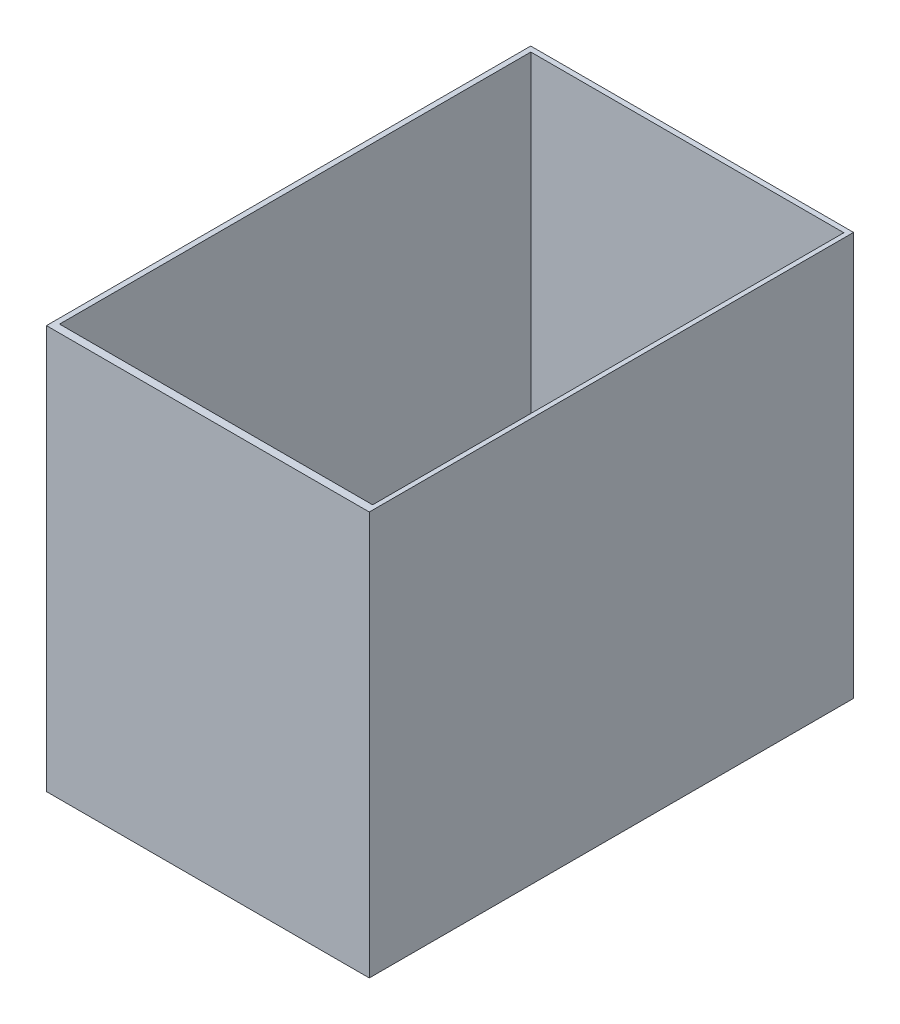
ISO-10303-21;
HEADER;
FILE_DESCRIPTION(('STEP AP214'),'2;1');
FILE_NAME('part.step','',(''),(''),'','','');
FILE_SCHEMA(('AUTOMOTIVE_DESIGN { 1 0 10303 214 1 1 1 1 }'));
ENDSEC;
DATA;
#1=APPLICATION_CONTEXT('core data for automotive mechanical design processes');
#2=APPLICATION_PROTOCOL_DEFINITION('international standard','automotive_design',2000,#1);
#3=PRODUCT_CONTEXT('',#1,'mechanical');
#4=PRODUCT('Part','Part','',(#3));
#5=PRODUCT_RELATED_PRODUCT_CATEGORY('part','',(#4));
#6=PRODUCT_DEFINITION_FORMATION('','',#4);
#7=PRODUCT_DEFINITION_CONTEXT('part definition',#1,'design');
#8=PRODUCT_DEFINITION('design','',#6,#7);
#9=PRODUCT_DEFINITION_SHAPE('','',#8);
#10=(LENGTH_UNIT() NAMED_UNIT(*) SI_UNIT(.MILLI.,.METRE.));
#11=(NAMED_UNIT(*) PLANE_ANGLE_UNIT() SI_UNIT($,.RADIAN.));
#12=(NAMED_UNIT(*) SI_UNIT($,.STERADIAN.) SOLID_ANGLE_UNIT());
#13=UNCERTAINTY_MEASURE_WITH_UNIT(LENGTH_MEASURE(1.E-05),#10,'distance_accuracy_value','');
#14=(GEOMETRIC_REPRESENTATION_CONTEXT(3) GLOBAL_UNCERTAINTY_ASSIGNED_CONTEXT((#13)) GLOBAL_UNIT_ASSIGNED_CONTEXT((#10,
#11,#12)) REPRESENTATION_CONTEXT('',''));
#15=CARTESIAN_POINT('',(0.,0.,0.));
#16=DIRECTION('',(0.,0.,1.));
#17=DIRECTION('',(1.,0.,0.));
#18=AXIS2_PLACEMENT_3D('',#15,#16,#17);
#19=CARTESIAN_POINT('',(-342.204724409449,1000.,-193.055118110236));
#20=DIRECTION('',(1.,0.,0.));
#21=DIRECTION('',(0.,0.,-1.));
#22=AXIS2_PLACEMENT_3D('',#19,#20,#21);
#23=PLANE('',#22);
#24=DIRECTION('',(0.,0.,1.));
#25=VECTOR('',#24,1.);
#26=CARTESIAN_POINT('',(-342.204724409449,0.,-193.055118110236));
#27=LINE('',#26,#25);
#28=CARTESIAN_POINT('',(-342.204724409449,0.,-193.055118110236));
#29=VERTEX_POINT('',#28);
#30=CARTESIAN_POINT('',(-342.204724409449,0.,1006.94488188976));
#31=VERTEX_POINT('',#30);
#32=EDGE_CURVE('E140',#29,#31,#27,.T.);
#33=ORIENTED_EDGE('',*,*,#32,.T.);
#34=DIRECTION('',(0.,-1.,0.));
#35=VECTOR('',#34,1.);
#36=CARTESIAN_POINT('',(-342.204724409449,1000.,1006.94488188976));
#37=LINE('',#36,#35);
#38=CARTESIAN_POINT('',(-342.204724409449,1000.,1006.94488188976));
#39=VERTEX_POINT('',#38);
#40=EDGE_CURVE('E11',#39,#31,#37,.T.);
#41=ORIENTED_EDGE('',*,*,#40,.F.);
#42=DIRECTION('',(0.,0.,1.));
#43=VECTOR('',#42,1.);
#44=CARTESIAN_POINT('',(-342.204724409449,1000.,-193.055118110236));
#45=LINE('',#44,#43);
#46=CARTESIAN_POINT('',(-342.204724409449,1000.,-193.055118110236));
#47=VERTEX_POINT('',#46);
#48=EDGE_CURVE('E144',#47,#39,#45,.T.);
#49=ORIENTED_EDGE('',*,*,#48,.F.);
#50=DIRECTION('',(0.,-1.,0.));
#51=VECTOR('',#50,1.);
#52=CARTESIAN_POINT('',(-342.204724409449,1000.,-193.055118110236));
#53=LINE('',#52,#51);
#54=EDGE_CURVE('E150',#47,#29,#53,.T.);
#55=ORIENTED_EDGE('',*,*,#54,.T.);
#56=EDGE_LOOP('',(#33,#41,#49,#55));
#57=FACE_BOUND('',#56,.T.);
#58=ADVANCED_FACE('F32',(#57),#23,.F.);
#59=CARTESIAN_POINT('',(-342.204724409449,1000.,1006.94488188976));
#60=DIRECTION('',(0.,0.,-1.));
#61=DIRECTION('',(-1.,0.,0.));
#62=AXIS2_PLACEMENT_3D('',#59,#60,#61);
#63=PLANE('',#62);
#64=DIRECTION('',(1.,0.,0.));
#65=VECTOR('',#64,1.);
#66=CARTESIAN_POINT('',(-342.204724409449,0.,1006.94488188976));
#67=LINE('',#66,#65);
#68=CARTESIAN_POINT('',(457.795275590551,0.,1006.94488188976));
#69=VERTEX_POINT('',#68);
#70=EDGE_CURVE('E153',#31,#69,#67,.T.);
#71=ORIENTED_EDGE('',*,*,#70,.T.);
#72=DIRECTION('',(0.,-1.,0.));
#73=VECTOR('',#72,1.);
#74=CARTESIAN_POINT('',(457.795275590551,1000.,1006.94488188976));
#75=LINE('',#74,#73);
#76=CARTESIAN_POINT('',(457.795275590551,1000.,1006.94488188976));
#77=VERTEX_POINT('',#76);
#78=EDGE_CURVE('E39',#77,#69,#75,.T.);
#79=ORIENTED_EDGE('',*,*,#78,.F.);
#80=DIRECTION('',(1.,0.,0.));
#81=VECTOR('',#80,1.);
#82=CARTESIAN_POINT('',(-342.204724409449,1000.,1006.94488188976));
#83=LINE('',#82,#81);
#84=EDGE_CURVE('E83',#39,#77,#83,.T.);
#85=ORIENTED_EDGE('',*,*,#84,.F.);
#86=ORIENTED_EDGE('',*,*,#40,.T.);
#87=EDGE_LOOP('',(#71,#79,#85,#86));
#88=FACE_BOUND('',#87,.T.);
#89=ADVANCED_FACE('F182',(#88),#63,.F.);
#90=CARTESIAN_POINT('',(457.795275590551,1000.,-193.055118110236));
#91=DIRECTION('',(-1.,0.,0.));
#92=DIRECTION('',(0.,0.,1.));
#93=AXIS2_PLACEMENT_3D('',#90,#91,#92);
#94=PLANE('',#93);
#95=DIRECTION('',(0.,0.,-1.));
#96=VECTOR('',#95,1.);
#97=CARTESIAN_POINT('',(457.795275590551,0.,-193.055118110236));
#98=LINE('',#97,#96);
#99=CARTESIAN_POINT('',(457.795275590551,0.,-193.055118110236));
#100=VERTEX_POINT('',#99);
#101=EDGE_CURVE('E155',#69,#100,#98,.T.);
#102=ORIENTED_EDGE('',*,*,#101,.T.);
#103=DIRECTION('',(0.,-1.,0.));
#104=VECTOR('',#103,1.);
#105=CARTESIAN_POINT('',(457.795275590551,1000.,-193.055118110236));
#106=LINE('',#105,#104);
#107=CARTESIAN_POINT('',(457.795275590551,1000.,-193.055118110236));
#108=VERTEX_POINT('',#107);
#109=EDGE_CURVE('E159',#108,#100,#106,.T.);
#110=ORIENTED_EDGE('',*,*,#109,.F.);
#111=DIRECTION('',(0.,0.,-1.));
#112=VECTOR('',#111,1.);
#113=CARTESIAN_POINT('',(457.795275590551,1000.,-193.055118110236));
#114=LINE('',#113,#112);
#115=EDGE_CURVE('E147',#77,#108,#114,.T.);
#116=ORIENTED_EDGE('',*,*,#115,.F.);
#117=ORIENTED_EDGE('',*,*,#78,.T.);
#118=EDGE_LOOP('',(#102,#110,#116,#117));
#119=FACE_BOUND('',#118,.T.);
#120=ADVANCED_FACE('F164',(#119),#94,.F.);
#121=CARTESIAN_POINT('',(-342.204724409449,1000.,-193.055118110236));
#122=DIRECTION('',(0.,0.,1.));
#123=DIRECTION('',(1.,0.,0.));
#124=AXIS2_PLACEMENT_3D('',#121,#122,#123);
#125=PLANE('',#124);
#126=DIRECTION('',(-1.,0.,0.));
#127=VECTOR('',#126,1.);
#128=CARTESIAN_POINT('',(-342.204724409449,0.,-193.055118110236));
#129=LINE('',#128,#127);
#130=EDGE_CURVE('E76',#100,#29,#129,.T.);
#131=ORIENTED_EDGE('',*,*,#130,.T.);
#132=ORIENTED_EDGE('',*,*,#54,.F.);
#133=DIRECTION('',(-1.,0.,0.));
#134=VECTOR('',#133,1.);
#135=CARTESIAN_POINT('',(-342.204724409449,1000.,-193.055118110236));
#136=LINE('',#135,#134);
#137=EDGE_CURVE('E55',#108,#47,#136,.T.);
#138=ORIENTED_EDGE('',*,*,#137,.F.);
#139=ORIENTED_EDGE('',*,*,#109,.T.);
#140=EDGE_LOOP('',(#131,#132,#138,#139));
#141=FACE_BOUND('',#140,.T.);
#142=ADVANCED_FACE('F172',(#141),#125,.F.);
#143=CARTESIAN_POINT('',(0.,1000.,0.));
#144=DIRECTION('',(0.,1.,0.));
#145=DIRECTION('',(0.,0.,1.));
#146=AXIS2_PLACEMENT_3D('',#143,#144,#145);
#147=PLANE('',#146);
#148=DIRECTION('',(0.,0.,1.));
#149=VECTOR('',#148,1.);
#150=CARTESIAN_POINT('',(-329.188594997637,1000.,-180.26833564313));
#151=LINE('',#150,#149);
#152=CARTESIAN_POINT('',(-329.188594997637,1000.,-180.26833564313));
#153=VERTEX_POINT('',#152);
#154=CARTESIAN_POINT('',(-329.188594997637,1000.,987.456664700449));
#155=VERTEX_POINT('',#154);
#156=EDGE_CURVE('E46',#153,#155,#151,.T.);
#157=ORIENTED_EDGE('',*,*,#156,.F.);
#158=DIRECTION('',(-1.,0.,0.));
#159=VECTOR('',#158,1.);
#160=CARTESIAN_POINT('',(-329.188594997637,1000.,-180.26833564313));
#161=LINE('',#160,#159);
#162=CARTESIAN_POINT('',(446.502474097165,1000.,-180.26833564313));
#163=VERTEX_POINT('',#162);
#164=EDGE_CURVE('E125',#163,#153,#161,.T.);
#165=ORIENTED_EDGE('',*,*,#164,.F.);
#166=DIRECTION('',(0.,0.,-1.));
#167=VECTOR('',#166,1.);
#168=CARTESIAN_POINT('',(446.502474097165,1000.,-180.26833564313));
#169=LINE('',#168,#167);
#170=CARTESIAN_POINT('',(446.502474097165,1000.,987.456664700449));
#171=VERTEX_POINT('',#170);
#172=EDGE_CURVE('E128',#171,#163,#169,.T.);
#173=ORIENTED_EDGE('',*,*,#172,.F.);
#174=DIRECTION('',(1.,0.,0.));
#175=VECTOR('',#174,1.);
#176=CARTESIAN_POINT('',(-329.188594997637,1000.,987.456664700449));
#177=LINE('',#176,#175);
#178=EDGE_CURVE('E134',#155,#171,#177,.T.);
#179=ORIENTED_EDGE('',*,*,#178,.F.);
#180=EDGE_LOOP('',(#157,#165,#173,#179));
#181=FACE_BOUND('',#180,.T.);
#182=ORIENTED_EDGE('',*,*,#48,.T.);
#183=ORIENTED_EDGE('',*,*,#84,.T.);
#184=ORIENTED_EDGE('',*,*,#115,.T.);
#185=ORIENTED_EDGE('',*,*,#137,.T.);
#186=EDGE_LOOP('',(#182,#183,#184,#185));
#187=FACE_BOUND('',#186,.T.);
#188=ADVANCED_FACE('F174',(#181,#187),#147,.T.);
#189=CARTESIAN_POINT('',(0.,0.,0.));
#190=DIRECTION('',(0.,1.,0.));
#191=DIRECTION('',(0.,0.,1.));
#192=AXIS2_PLACEMENT_3D('',#189,#190,#191);
#193=PLANE('',#192);
#194=ORIENTED_EDGE('',*,*,#32,.F.);
#195=ORIENTED_EDGE('',*,*,#130,.F.);
#196=ORIENTED_EDGE('',*,*,#101,.F.);
#197=ORIENTED_EDGE('',*,*,#70,.F.);
#198=EDGE_LOOP('',(#194,#195,#196,#197));
#199=FACE_BOUND('',#198,.T.);
#200=ADVANCED_FACE('F168',(#199),#193,.F.);
#201=CARTESIAN_POINT('',(-329.188594997637,100.,-180.26833564313));
#202=DIRECTION('',(-1.,0.,0.));
#203=DIRECTION('',(0.,0.,1.));
#204=AXIS2_PLACEMENT_3D('',#201,#202,#203);
#205=PLANE('',#204);
#206=ORIENTED_EDGE('',*,*,#156,.T.);
#207=DIRECTION('',(0.,1.,0.));
#208=VECTOR('',#207,1.);
#209=CARTESIAN_POINT('',(-329.188594997637,100.,987.456664700449));
#210=LINE('',#209,#208);
#211=CARTESIAN_POINT('',(-329.188594997637,100.,987.456664700449));
#212=VERTEX_POINT('',#211);
#213=EDGE_CURVE('E103',#212,#155,#210,.T.);
#214=ORIENTED_EDGE('',*,*,#213,.F.);
#215=DIRECTION('',(0.,0.,1.));
#216=VECTOR('',#215,1.);
#217=CARTESIAN_POINT('',(-329.188594997637,100.,-180.26833564313));
#218=LINE('',#217,#216);
#219=CARTESIAN_POINT('',(-329.188594997637,100.,-180.26833564313));
#220=VERTEX_POINT('',#219);
#221=EDGE_CURVE('E107',#220,#212,#218,.T.);
#222=ORIENTED_EDGE('',*,*,#221,.F.);
#223=DIRECTION('',(0.,1.,0.));
#224=VECTOR('',#223,1.);
#225=CARTESIAN_POINT('',(-329.188594997637,100.,-180.26833564313));
#226=LINE('',#225,#224);
#227=EDGE_CURVE('E138',#220,#153,#226,.T.);
#228=ORIENTED_EDGE('',*,*,#227,.T.);
#229=EDGE_LOOP('',(#206,#214,#222,#228));
#230=FACE_BOUND('',#229,.T.);
#231=ADVANCED_FACE('F105',(#230),#205,.F.);
#232=CARTESIAN_POINT('',(-329.188594997637,100.,-180.26833564313));
#233=DIRECTION('',(0.,0.,-1.));
#234=DIRECTION('',(-1.,0.,0.));
#235=AXIS2_PLACEMENT_3D('',#232,#233,#234);
#236=PLANE('',#235);
#237=ORIENTED_EDGE('',*,*,#164,.T.);
#238=ORIENTED_EDGE('',*,*,#227,.F.);
#239=DIRECTION('',(-1.,0.,0.));
#240=VECTOR('',#239,1.);
#241=CARTESIAN_POINT('',(-329.188594997637,100.,-180.26833564313));
#242=LINE('',#241,#240);
#243=CARTESIAN_POINT('',(446.502474097165,100.,-180.26833564313));
#244=VERTEX_POINT('',#243);
#245=EDGE_CURVE('E113',#244,#220,#242,.T.);
#246=ORIENTED_EDGE('',*,*,#245,.F.);
#247=DIRECTION('',(0.,1.,0.));
#248=VECTOR('',#247,1.);
#249=CARTESIAN_POINT('',(446.502474097165,100.,-180.26833564313));
#250=LINE('',#249,#248);
#251=EDGE_CURVE('E141',#244,#163,#250,.T.);
#252=ORIENTED_EDGE('',*,*,#251,.T.);
#253=EDGE_LOOP('',(#237,#238,#246,#252));
#254=FACE_BOUND('',#253,.T.);
#255=ADVANCED_FACE('F221',(#254),#236,.F.);
#256=CARTESIAN_POINT('',(446.502474097165,100.,-180.26833564313));
#257=DIRECTION('',(1.,0.,0.));
#258=DIRECTION('',(0.,0.,-1.));
#259=AXIS2_PLACEMENT_3D('',#256,#257,#258);
#260=PLANE('',#259);
#261=ORIENTED_EDGE('',*,*,#172,.T.);
#262=ORIENTED_EDGE('',*,*,#251,.F.);
#263=DIRECTION('',(0.,0.,-1.));
#264=VECTOR('',#263,1.);
#265=CARTESIAN_POINT('',(446.502474097165,100.,-180.26833564313));
#266=LINE('',#265,#264);
#267=CARTESIAN_POINT('',(446.502474097165,100.,987.456664700449));
#268=VERTEX_POINT('',#267);
#269=EDGE_CURVE('E121',#268,#244,#266,.T.);
#270=ORIENTED_EDGE('',*,*,#269,.F.);
#271=DIRECTION('',(0.,1.,0.));
#272=VECTOR('',#271,1.);
#273=CARTESIAN_POINT('',(446.502474097165,100.,987.456664700449));
#274=LINE('',#273,#272);
#275=EDGE_CURVE('E112',#268,#171,#274,.T.);
#276=ORIENTED_EDGE('',*,*,#275,.T.);
#277=EDGE_LOOP('',(#261,#262,#270,#276));
#278=FACE_BOUND('',#277,.T.);
#279=ADVANCED_FACE('F230',(#278),#260,.F.);
#280=CARTESIAN_POINT('',(-329.188594997637,100.,987.456664700449));
#281=DIRECTION('',(0.,0.,1.));
#282=DIRECTION('',(1.,0.,0.));
#283=AXIS2_PLACEMENT_3D('',#280,#281,#282);
#284=PLANE('',#283);
#285=ORIENTED_EDGE('',*,*,#178,.T.);
#286=ORIENTED_EDGE('',*,*,#275,.F.);
#287=DIRECTION('',(1.,0.,0.));
#288=VECTOR('',#287,1.);
#289=CARTESIAN_POINT('',(-329.188594997637,100.,987.456664700449));
#290=LINE('',#289,#288);
#291=EDGE_CURVE('E116',#212,#268,#290,.T.);
#292=ORIENTED_EDGE('',*,*,#291,.F.);
#293=ORIENTED_EDGE('',*,*,#213,.T.);
#294=EDGE_LOOP('',(#285,#286,#292,#293));
#295=FACE_BOUND('',#294,.T.);
#296=ADVANCED_FACE('F117',(#295),#284,.F.);
#297=CARTESIAN_POINT('',(0.,100.,0.));
#298=DIRECTION('',(0.,1.,0.));
#299=DIRECTION('',(0.,0.,1.));
#300=AXIS2_PLACEMENT_3D('',#297,#298,#299);
#301=PLANE('',#300);
#302=ORIENTED_EDGE('',*,*,#221,.T.);
#303=ORIENTED_EDGE('',*,*,#291,.T.);
#304=ORIENTED_EDGE('',*,*,#269,.T.);
#305=ORIENTED_EDGE('',*,*,#245,.T.);
#306=EDGE_LOOP('',(#302,#303,#304,#305));
#307=FACE_BOUND('',#306,.T.);
#308=ADVANCED_FACE('F123',(#307),#301,.T.);
#309=CLOSED_SHELL('',(#58,#89,#120,#142,#188,#200,#231,#255,#279,#296,#308));
#310=MANIFOLD_SOLID_BREP('B2',#309);
#311=ADVANCED_BREP_SHAPE_REPRESENTATION('',(#18,#310),#14);
#312=SHAPE_DEFINITION_REPRESENTATION(#9,#311);
ENDSEC;
END-ISO-10303-21;
